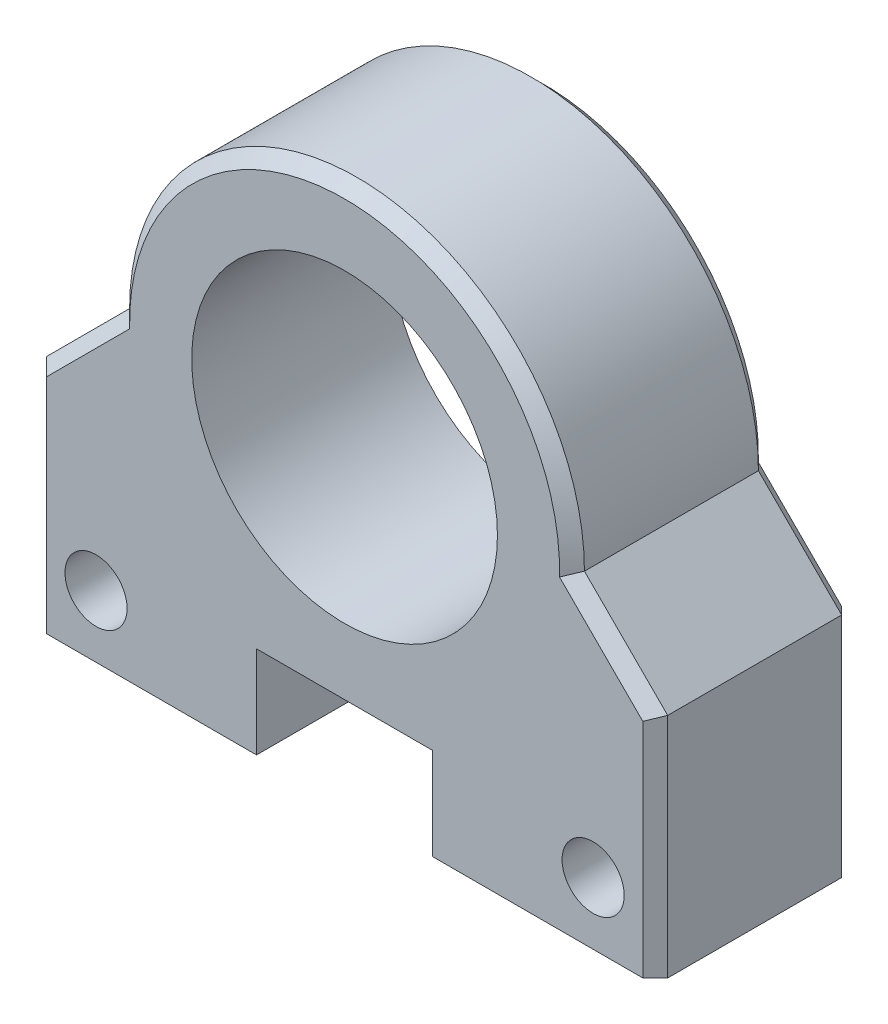
ISO-10303-21;
HEADER;
FILE_DESCRIPTION(('STEP AP214'),'2;1');
FILE_NAME('part.step','',(''),(''),'','','');
FILE_SCHEMA(('AUTOMOTIVE_DESIGN { 1 0 10303 214 1 1 1 1 }'));
ENDSEC;
DATA;
#1=APPLICATION_CONTEXT('core data for automotive mechanical design processes');
#2=APPLICATION_PROTOCOL_DEFINITION('international standard','automotive_design',2000,#1);
#3=PRODUCT_CONTEXT('',#1,'mechanical');
#4=PRODUCT('Part','Part','',(#3));
#5=PRODUCT_RELATED_PRODUCT_CATEGORY('part','',(#4));
#6=PRODUCT_DEFINITION_FORMATION('','',#4);
#7=PRODUCT_DEFINITION_CONTEXT('part definition',#1,'design');
#8=PRODUCT_DEFINITION('design','',#6,#7);
#9=PRODUCT_DEFINITION_SHAPE('','',#8);
#10=(LENGTH_UNIT() NAMED_UNIT(*) SI_UNIT(.MILLI.,.METRE.));
#11=(NAMED_UNIT(*) PLANE_ANGLE_UNIT() SI_UNIT($,.RADIAN.));
#12=(NAMED_UNIT(*) SI_UNIT($,.STERADIAN.) SOLID_ANGLE_UNIT());
#13=UNCERTAINTY_MEASURE_WITH_UNIT(LENGTH_MEASURE(1.E-05),#10,'distance_accuracy_value','');
#14=(GEOMETRIC_REPRESENTATION_CONTEXT(3) GLOBAL_UNCERTAINTY_ASSIGNED_CONTEXT((#13)) GLOBAL_UNIT_ASSIGNED_CONTEXT((#10,
#11,#12)) REPRESENTATION_CONTEXT('',''));
#15=CARTESIAN_POINT('',(0.,0.,0.));
#16=DIRECTION('',(0.,0.,1.));
#17=DIRECTION('',(1.,0.,0.));
#18=AXIS2_PLACEMENT_3D('',#15,#16,#17);
#19=CARTESIAN_POINT('',(0.,15.875,10.16));
#20=DIRECTION('',(0.,0.,-1.));
#21=DIRECTION('',(-1.,0.,0.));
#22=AXIS2_PLACEMENT_3D('',#19,#20,#21);
#23=PLANE('',#22);
#24=CARTESIAN_POINT('',(12.7,3.175,10.16));
#25=DIRECTION('',(0.,0.,1.));
#26=DIRECTION('',(-1.,0.,0.));
#27=AXIS2_PLACEMENT_3D('',#24,#25,#26);
#28=CIRCLE('',#27,1.5875);
#29=CARTESIAN_POINT('',(11.1125,3.175,10.16));
#30=VERTEX_POINT('',#29);
#31=EDGE_CURVE('E405',#30,#30,#28,.T.);
#32=ORIENTED_EDGE('',*,*,#31,.F.);
#33=EDGE_LOOP('',(#32));
#34=FACE_BOUND('',#33,.T.);
#35=CARTESIAN_POINT('',(-12.7,3.175,10.16));
#36=DIRECTION('',(0.,0.,1.));
#37=DIRECTION('',(1.,0.,0.));
#38=AXIS2_PLACEMENT_3D('',#35,#36,#37);
#39=CIRCLE('',#38,1.5875);
#40=CARTESIAN_POINT('',(-11.1125,3.175,10.16));
#41=VERTEX_POINT('',#40);
#42=EDGE_CURVE('E398',#41,#41,#39,.T.);
#43=ORIENTED_EDGE('',*,*,#42,.F.);
#44=EDGE_LOOP('',(#43));
#45=FACE_BOUND('',#44,.T.);
#46=DIRECTION('',(1.,0.,0.));
#47=VECTOR('',#46,1.);
#48=CARTESIAN_POINT('',(4.5,0.,10.16));
#49=LINE('',#48,#47);
#50=CARTESIAN_POINT('',(4.5,0.,10.16));
#51=VERTEX_POINT('',#50);
#52=CARTESIAN_POINT('',(15.24,0.,10.16));
#53=VERTEX_POINT('',#52);
#54=EDGE_CURVE('E389',#51,#53,#49,.T.);
#55=ORIENTED_EDGE('',*,*,#54,.T.);
#56=DIRECTION('',(0.,1.,0.));
#57=VECTOR('',#56,1.);
#58=CARTESIAN_POINT('',(15.24,15.875,10.16));
#59=LINE('',#58,#57);
#60=CARTESIAN_POINT('',(15.24,11.3574743878931,10.16));
#61=VERTEX_POINT('',#60);
#62=EDGE_CURVE('E11',#53,#61,#59,.T.);
#63=ORIENTED_EDGE('',*,*,#62,.T.);
#64=DIRECTION('',(-0.707106781186549,0.707106781186546,0.));
#65=VECTOR('',#64,1.);
#66=CARTESIAN_POINT('',(5.36123719394652,21.2362371939465,10.16));
#67=LINE('',#66,#65);
#68=CARTESIAN_POINT('',(10.9824239792477,15.6150504086454,10.16));
#69=VERTEX_POINT('',#68);
#70=EDGE_CURVE('E41',#61,#69,#67,.T.);
#71=ORIENTED_EDGE('',*,*,#70,.T.);
#72=CARTESIAN_POINT('',(0.,15.875,10.16));
#73=DIRECTION('',(0.,0.,-1.));
#74=DIRECTION('',(-1.,0.,0.));
#75=AXIS2_PLACEMENT_3D('',#72,#73,#74);
#76=CIRCLE('',#75,10.9855);
#77=CARTESIAN_POINT('',(-10.9824239792477,15.6150504086454,10.16));
#78=VERTEX_POINT('',#77);
#79=EDGE_CURVE('E218',#69,#78,#76,.F.);
#80=ORIENTED_EDGE('',*,*,#79,.T.);
#81=DIRECTION('',(-0.707106781186549,-0.707106781186546,0.));
#82=VECTOR('',#81,1.);
#83=CARTESIAN_POINT('',(-5.36123719394652,21.2362371939465,10.16));
#84=LINE('',#83,#82);
#85=CARTESIAN_POINT('',(-15.24,11.3574743878931,10.16));
#86=VERTEX_POINT('',#85);
#87=EDGE_CURVE('E57',#78,#86,#84,.T.);
#88=ORIENTED_EDGE('',*,*,#87,.T.);
#89=DIRECTION('',(0.,-1.,0.));
#90=VECTOR('',#89,1.);
#91=CARTESIAN_POINT('',(-15.24,15.875,10.16));
#92=LINE('',#91,#90);
#93=CARTESIAN_POINT('',(-15.24,0.,10.16));
#94=VERTEX_POINT('',#93);
#95=EDGE_CURVE('E221',#86,#94,#92,.T.);
#96=ORIENTED_EDGE('',*,*,#95,.T.);
#97=DIRECTION('',(1.,0.,0.));
#98=VECTOR('',#97,1.);
#99=CARTESIAN_POINT('',(-4.5,0.,10.16));
#100=LINE('',#99,#98);
#101=CARTESIAN_POINT('',(-4.5,0.,10.16));
#102=VERTEX_POINT('',#101);
#103=EDGE_CURVE('E165',#94,#102,#100,.T.);
#104=ORIENTED_EDGE('',*,*,#103,.T.);
#105=DIRECTION('',(0.,1.,0.));
#106=VECTOR('',#105,1.);
#107=CARTESIAN_POINT('',(-4.5,4.699,10.16));
#108=LINE('',#107,#106);
#109=CARTESIAN_POINT('',(-4.5,4.699,10.16));
#110=VERTEX_POINT('',#109);
#111=EDGE_CURVE('E159',#102,#110,#108,.T.);
#112=ORIENTED_EDGE('',*,*,#111,.T.);
#113=DIRECTION('',(1.,0.,0.));
#114=VECTOR('',#113,1.);
#115=CARTESIAN_POINT('',(4.5,4.699,10.16));
#116=LINE('',#115,#114);
#117=CARTESIAN_POINT('',(4.5,4.699,10.16));
#118=VERTEX_POINT('',#117);
#119=EDGE_CURVE('E149',#110,#118,#116,.T.);
#120=ORIENTED_EDGE('',*,*,#119,.T.);
#121=DIRECTION('',(0.,-1.,0.));
#122=VECTOR('',#121,1.);
#123=CARTESIAN_POINT('',(4.5,4.699,10.16));
#124=LINE('',#123,#122);
#125=EDGE_CURVE('E158',#118,#51,#124,.T.);
#126=ORIENTED_EDGE('',*,*,#125,.T.);
#127=EDGE_LOOP('',(#55,#63,#71,#80,#88,#96,#104,#112,#120,#126));
#128=FACE_BOUND('',#127,.T.);
#129=CARTESIAN_POINT('',(0.,15.875,10.16));
#130=DIRECTION('',(0.,0.,1.));
#131=DIRECTION('',(1.,0.,0.));
#132=AXIS2_PLACEMENT_3D('',#129,#130,#131);
#133=CIRCLE('',#132,7.8105);
#134=CARTESIAN_POINT('',(7.8105,15.875,10.16));
#135=VERTEX_POINT('',#134);
#136=EDGE_CURVE('E387',#135,#135,#133,.T.);
#137=ORIENTED_EDGE('',*,*,#136,.F.);
#138=EDGE_LOOP('',(#137));
#139=FACE_BOUND('',#138,.T.);
#140=ADVANCED_FACE('F32',(#34,#45,#128,#139),#23,.F.);
#141=CARTESIAN_POINT('',(0.,15.875,0.));
#142=DIRECTION('',(0.,0.,-1.));
#143=DIRECTION('',(-1.,0.,0.));
#144=AXIS2_PLACEMENT_3D('',#141,#142,#143);
#145=PLANE('',#144);
#146=CARTESIAN_POINT('',(12.7,3.175,0.));
#147=DIRECTION('',(0.,0.,1.));
#148=DIRECTION('',(-1.,0.,0.));
#149=AXIS2_PLACEMENT_3D('',#146,#147,#148);
#150=CIRCLE('',#149,1.5875);
#151=CARTESIAN_POINT('',(11.1125,3.175,0.));
#152=VERTEX_POINT('',#151);
#153=EDGE_CURVE('E402',#152,#152,#150,.T.);
#154=ORIENTED_EDGE('',*,*,#153,.T.);
#155=EDGE_LOOP('',(#154));
#156=FACE_BOUND('',#155,.T.);
#157=CARTESIAN_POINT('',(-12.7,3.175,0.));
#158=DIRECTION('',(0.,0.,1.));
#159=DIRECTION('',(1.,0.,0.));
#160=AXIS2_PLACEMENT_3D('',#157,#158,#159);
#161=CIRCLE('',#160,1.5875);
#162=CARTESIAN_POINT('',(-11.1125,3.175,0.));
#163=VERTEX_POINT('',#162);
#164=EDGE_CURVE('E401',#163,#163,#161,.T.);
#165=ORIENTED_EDGE('',*,*,#164,.T.);
#166=EDGE_LOOP('',(#165));
#167=FACE_BOUND('',#166,.T.);
#168=DIRECTION('',(0.707106781186549,-0.707106781186546,0.));
#169=VECTOR('',#168,1.);
#170=CARTESIAN_POINT('',(15.4259871939465,11.1714871939466,0.));
#171=LINE('',#170,#169);
#172=CARTESIAN_POINT('',(10.9824239792477,15.6150504086454,0.));
#173=VERTEX_POINT('',#172);
#174=CARTESIAN_POINT('',(15.24,11.3574743878931,0.));
#175=VERTEX_POINT('',#174);
#176=EDGE_CURVE('E190',#173,#175,#171,.T.);
#177=ORIENTED_EDGE('',*,*,#176,.T.);
#178=DIRECTION('',(0.,-1.,0.));
#179=VECTOR('',#178,1.);
#180=CARTESIAN_POINT('',(15.24,0.,0.));
#181=LINE('',#180,#179);
#182=CARTESIAN_POINT('',(15.24,0.,0.));
#183=VERTEX_POINT('',#182);
#184=EDGE_CURVE('E192',#175,#183,#181,.T.);
#185=ORIENTED_EDGE('',*,*,#184,.T.);
#186=DIRECTION('',(1.,0.,0.));
#187=VECTOR('',#186,1.);
#188=CARTESIAN_POINT('',(4.5,0.,0.));
#189=LINE('',#188,#187);
#190=CARTESIAN_POINT('',(4.5,0.,0.));
#191=VERTEX_POINT('',#190);
#192=EDGE_CURVE('E359',#191,#183,#189,.T.);
#193=ORIENTED_EDGE('',*,*,#192,.F.);
#194=DIRECTION('',(0.,-1.,0.));
#195=VECTOR('',#194,1.);
#196=CARTESIAN_POINT('',(4.5,4.699,0.));
#197=LINE('',#196,#195);
#198=CARTESIAN_POINT('',(4.5,4.699,0.));
#199=VERTEX_POINT('',#198);
#200=EDGE_CURVE('E382',#199,#191,#197,.T.);
#201=ORIENTED_EDGE('',*,*,#200,.F.);
#202=DIRECTION('',(1.,0.,0.));
#203=VECTOR('',#202,1.);
#204=CARTESIAN_POINT('',(4.5,4.699,0.));
#205=LINE('',#204,#203);
#206=CARTESIAN_POINT('',(-4.5,4.699,0.));
#207=VERTEX_POINT('',#206);
#208=EDGE_CURVE('E384',#207,#199,#205,.T.);
#209=ORIENTED_EDGE('',*,*,#208,.F.);
#210=DIRECTION('',(0.,1.,0.));
#211=VECTOR('',#210,1.);
#212=CARTESIAN_POINT('',(-4.5,4.699,0.));
#213=LINE('',#212,#211);
#214=CARTESIAN_POINT('',(-4.5,0.,0.));
#215=VERTEX_POINT('',#214);
#216=EDGE_CURVE('E173',#215,#207,#213,.T.);
#217=ORIENTED_EDGE('',*,*,#216,.F.);
#218=DIRECTION('',(1.,0.,0.));
#219=VECTOR('',#218,1.);
#220=CARTESIAN_POINT('',(-4.5,0.,0.));
#221=LINE('',#220,#219);
#222=CARTESIAN_POINT('',(-15.24,0.,0.));
#223=VERTEX_POINT('',#222);
#224=EDGE_CURVE('E169',#223,#215,#221,.T.);
#225=ORIENTED_EDGE('',*,*,#224,.F.);
#226=DIRECTION('',(0.,1.,0.));
#227=VECTOR('',#226,1.);
#228=CARTESIAN_POINT('',(-15.24,11.6205,0.));
#229=LINE('',#228,#227);
#230=CARTESIAN_POINT('',(-15.24,11.3574743878931,0.));
#231=VERTEX_POINT('',#230);
#232=EDGE_CURVE('E188',#223,#231,#229,.T.);
#233=ORIENTED_EDGE('',*,*,#232,.T.);
#234=DIRECTION('',(0.707106781186549,0.707106781186546,0.));
#235=VECTOR('',#234,1.);
#236=CARTESIAN_POINT('',(-11.1714871939465,15.4259871939465,0.));
#237=LINE('',#236,#235);
#238=CARTESIAN_POINT('',(-10.9824239792477,15.6150504086454,0.));
#239=VERTEX_POINT('',#238);
#240=EDGE_CURVE('E186',#231,#239,#237,.T.);
#241=ORIENTED_EDGE('',*,*,#240,.T.);
#242=CARTESIAN_POINT('',(0.,15.875,0.));
#243=DIRECTION('',(0.,0.,-1.));
#244=DIRECTION('',(-1.,0.,0.));
#245=AXIS2_PLACEMENT_3D('',#242,#243,#244);
#246=CIRCLE('',#245,10.9855);
#247=EDGE_CURVE('E184',#239,#173,#246,.T.);
#248=ORIENTED_EDGE('',*,*,#247,.T.);
#249=EDGE_LOOP('',(#177,#185,#193,#201,#209,#217,#225,#233,#241,#248));
#250=FACE_BOUND('',#249,.T.);
#251=CARTESIAN_POINT('',(0.,15.875,0.));
#252=DIRECTION('',(0.,0.,1.));
#253=DIRECTION('',(1.,0.,0.));
#254=AXIS2_PLACEMENT_3D('',#251,#252,#253);
#255=CIRCLE('',#254,7.8105);
#256=CARTESIAN_POINT('',(7.8105,15.875,0.));
#257=VERTEX_POINT('',#256);
#258=EDGE_CURVE('E392',#257,#257,#255,.T.);
#259=ORIENTED_EDGE('',*,*,#258,.T.);
#260=EDGE_LOOP('',(#259));
#261=FACE_BOUND('',#260,.T.);
#262=ADVANCED_FACE('F294',(#156,#167,#250,#261),#145,.T.);
#263=CARTESIAN_POINT('',(-4.5,4.699,10.16));
#264=DIRECTION('',(-1.,0.,0.));
#265=DIRECTION('',(0.,0.,1.));
#266=AXIS2_PLACEMENT_3D('',#263,#264,#265);
#267=PLANE('',#266);
#268=ORIENTED_EDGE('',*,*,#216,.T.);
#269=DIRECTION('',(0.,0.,-1.));
#270=VECTOR('',#269,1.);
#271=CARTESIAN_POINT('',(-4.5,4.699,10.16));
#272=LINE('',#271,#270);
#273=EDGE_CURVE('E153',#110,#207,#272,.T.);
#274=ORIENTED_EDGE('',*,*,#273,.F.);
#275=ORIENTED_EDGE('',*,*,#111,.F.);
#276=DIRECTION('',(0.,0.,-1.));
#277=VECTOR('',#276,1.);
#278=CARTESIAN_POINT('',(-4.5,0.,10.16));
#279=LINE('',#278,#277);
#280=EDGE_CURVE('E378',#102,#215,#279,.T.);
#281=ORIENTED_EDGE('',*,*,#280,.T.);
#282=EDGE_LOOP('',(#268,#274,#275,#281));
#283=FACE_BOUND('',#282,.T.);
#284=ADVANCED_FACE('F171',(#283),#267,.F.);
#285=CARTESIAN_POINT('',(4.5,4.699,10.16));
#286=DIRECTION('',(0.,1.,0.));
#287=DIRECTION('',(0.,0.,1.));
#288=AXIS2_PLACEMENT_3D('',#285,#286,#287);
#289=PLANE('',#288);
#290=ORIENTED_EDGE('',*,*,#208,.T.);
#291=DIRECTION('',(0.,0.,-1.));
#292=VECTOR('',#291,1.);
#293=CARTESIAN_POINT('',(4.5,4.699,10.16));
#294=LINE('',#293,#292);
#295=EDGE_CURVE('E156',#118,#199,#294,.T.);
#296=ORIENTED_EDGE('',*,*,#295,.F.);
#297=ORIENTED_EDGE('',*,*,#119,.F.);
#298=ORIENTED_EDGE('',*,*,#273,.T.);
#299=EDGE_LOOP('',(#290,#296,#297,#298));
#300=FACE_BOUND('',#299,.T.);
#301=ADVANCED_FACE('F151',(#300),#289,.F.);
#302=CARTESIAN_POINT('',(4.5,4.699,10.16));
#303=DIRECTION('',(1.,0.,0.));
#304=DIRECTION('',(0.,0.,-1.));
#305=AXIS2_PLACEMENT_3D('',#302,#303,#304);
#306=PLANE('',#305);
#307=ORIENTED_EDGE('',*,*,#200,.T.);
#308=DIRECTION('',(0.,0.,-1.));
#309=VECTOR('',#308,1.);
#310=CARTESIAN_POINT('',(4.5,0.,10.16));
#311=LINE('',#310,#309);
#312=EDGE_CURVE('E178',#51,#191,#311,.T.);
#313=ORIENTED_EDGE('',*,*,#312,.F.);
#314=ORIENTED_EDGE('',*,*,#125,.F.);
#315=ORIENTED_EDGE('',*,*,#295,.T.);
#316=EDGE_LOOP('',(#307,#313,#314,#315));
#317=FACE_BOUND('',#316,.T.);
#318=ADVANCED_FACE('F334',(#317),#306,.F.);
#319=CARTESIAN_POINT('',(4.5,0.,10.16));
#320=DIRECTION('',(0.,1.,0.));
#321=DIRECTION('',(-1.,0.,0.));
#322=AXIS2_PLACEMENT_3D('',#319,#320,#321);
#323=PLANE('',#322);
#324=ORIENTED_EDGE('',*,*,#192,.T.);
#325=DIRECTION('',(0.707106781186551,0.,0.707106781186544));
#326=VECTOR('',#325,1.);
#327=CARTESIAN_POINT('',(15.875,0.,0.634999999999997));
#328=LINE('',#327,#326);
#329=CARTESIAN_POINT('',(15.875,0.,0.634999999999998));
#330=VERTEX_POINT('',#329);
#331=EDGE_CURVE('E196',#183,#330,#328,.T.);
#332=ORIENTED_EDGE('',*,*,#331,.T.);
#333=DIRECTION('',(0.,0.,-1.));
#334=VECTOR('',#333,1.);
#335=CARTESIAN_POINT('',(15.875,0.,10.16));
#336=LINE('',#335,#334);
#337=CARTESIAN_POINT('',(15.875,0.,9.525));
#338=VERTEX_POINT('',#337);
#339=EDGE_CURVE('E355',#338,#330,#336,.T.);
#340=ORIENTED_EDGE('',*,*,#339,.F.);
#341=DIRECTION('',(0.707106781186548,0.,-0.707106781186548));
#342=VECTOR('',#341,1.);
#343=CARTESIAN_POINT('',(15.24,0.,10.16));
#344=LINE('',#343,#342);
#345=EDGE_CURVE('E194',#338,#53,#344,.F.);
#346=ORIENTED_EDGE('',*,*,#345,.T.);
#347=ORIENTED_EDGE('',*,*,#54,.F.);
#348=ORIENTED_EDGE('',*,*,#312,.T.);
#349=EDGE_LOOP('',(#324,#332,#340,#346,#347,#348));
#350=FACE_BOUND('',#349,.T.);
#351=ADVANCED_FACE('F330',(#350),#323,.F.);
#352=CARTESIAN_POINT('',(15.875,0.,10.16));
#353=DIRECTION('',(-1.,0.,0.));
#354=DIRECTION('',(0.,0.,1.));
#355=AXIS2_PLACEMENT_3D('',#352,#353,#354);
#356=PLANE('',#355);
#357=ORIENTED_EDGE('',*,*,#339,.T.);
#358=DIRECTION('',(0.,1.,0.));
#359=VECTOR('',#358,1.);
#360=CARTESIAN_POINT('',(15.875,11.6205,0.634999999999997));
#361=LINE('',#360,#359);
#362=CARTESIAN_POINT('',(15.875,11.6205,0.634999999999997));
#363=VERTEX_POINT('',#362);
#364=EDGE_CURVE('E176',#330,#363,#361,.T.);
#365=ORIENTED_EDGE('',*,*,#364,.T.);
#366=DIRECTION('',(0.,0.,-1.));
#367=VECTOR('',#366,1.);
#368=CARTESIAN_POINT('',(15.875,11.6205,10.16));
#369=LINE('',#368,#367);
#370=CARTESIAN_POINT('',(15.875,11.6205,9.525));
#371=VERTEX_POINT('',#370);
#372=EDGE_CURVE('E362',#371,#363,#369,.T.);
#373=ORIENTED_EDGE('',*,*,#372,.F.);
#374=DIRECTION('',(0.,-1.,0.));
#375=VECTOR('',#374,1.);
#376=CARTESIAN_POINT('',(15.875,0.,9.525));
#377=LINE('',#376,#375);
#378=EDGE_CURVE('E174',#371,#338,#377,.T.);
#379=ORIENTED_EDGE('',*,*,#378,.T.);
#380=EDGE_LOOP('',(#357,#365,#373,#379));
#381=FACE_BOUND('',#380,.T.);
#382=ADVANCED_FACE('F326',(#381),#356,.F.);
#383=CARTESIAN_POINT('',(15.875,11.6205,10.16));
#384=DIRECTION('',(-0.707106781186546,-0.707106781186549,0.));
#385=DIRECTION('',(0.707106781186549,-0.707106781186546,0.));
#386=AXIS2_PLACEMENT_3D('',#383,#384,#385);
#387=PLANE('',#386);
#388=ORIENTED_EDGE('',*,*,#372,.T.);
#389=DIRECTION('',(-0.707106781186549,0.707106781186546,0.));
#390=VECTOR('',#389,1.);
#391=CARTESIAN_POINT('',(11.6205,15.875,0.634999999999997));
#392=LINE('',#391,#390);
#393=CARTESIAN_POINT('',(11.6205,15.875,0.634999999999997));
#394=VERTEX_POINT('',#393);
#395=EDGE_CURVE('E200',#363,#394,#392,.T.);
#396=ORIENTED_EDGE('',*,*,#395,.T.);
#397=DIRECTION('',(0.,0.,-1.));
#398=VECTOR('',#397,1.);
#399=CARTESIAN_POINT('',(11.6205,15.875,10.16));
#400=LINE('',#399,#398);
#401=CARTESIAN_POINT('',(11.6205,15.875,9.525));
#402=VERTEX_POINT('',#401);
#403=EDGE_CURVE('E364',#402,#394,#400,.T.);
#404=ORIENTED_EDGE('',*,*,#403,.F.);
#405=DIRECTION('',(0.707106781186549,-0.707106781186546,0.));
#406=VECTOR('',#405,1.);
#407=CARTESIAN_POINT('',(15.875,11.6205,9.525));
#408=LINE('',#407,#406);
#409=EDGE_CURVE('E198',#402,#371,#408,.T.);
#410=ORIENTED_EDGE('',*,*,#409,.T.);
#411=EDGE_LOOP('',(#388,#396,#404,#410));
#412=FACE_BOUND('',#411,.T.);
#413=ADVANCED_FACE('F322',(#412),#387,.F.);
#414=CARTESIAN_POINT('',(0.,15.875,10.16));
#415=DIRECTION('',(0.,0.,-1.));
#416=DIRECTION('',(-1.,0.,0.));
#417=AXIS2_PLACEMENT_3D('',#414,#415,#416);
#418=CYLINDRICAL_SURFACE('',#417,11.6205);
#419=ORIENTED_EDGE('',*,*,#403,.T.);
#420=CARTESIAN_POINT('',(0.,15.875,0.634999999999997));
#421=DIRECTION('',(0.,0.,-1.));
#422=DIRECTION('',(-1.,0.,0.));
#423=AXIS2_PLACEMENT_3D('',#420,#421,#422);
#424=CIRCLE('',#423,11.6205);
#425=CARTESIAN_POINT('',(-11.6205,15.875,0.634999999999997));
#426=VERTEX_POINT('',#425);
#427=EDGE_CURVE('E216',#394,#426,#424,.F.);
#428=ORIENTED_EDGE('',*,*,#427,.T.);
#429=DIRECTION('',(0.,0.,-1.));
#430=VECTOR('',#429,1.);
#431=CARTESIAN_POINT('',(-11.6205,15.875,10.16));
#432=LINE('',#431,#430);
#433=CARTESIAN_POINT('',(-11.6205,15.875,9.525));
#434=VERTEX_POINT('',#433);
#435=EDGE_CURVE('E369',#434,#426,#432,.T.);
#436=ORIENTED_EDGE('',*,*,#435,.F.);
#437=CARTESIAN_POINT('',(0.,15.875,9.525));
#438=DIRECTION('',(0.,0.,-1.));
#439=DIRECTION('',(-1.,0.,0.));
#440=AXIS2_PLACEMENT_3D('',#437,#438,#439);
#441=CIRCLE('',#440,11.6205);
#442=EDGE_CURVE('E214',#434,#402,#441,.T.);
#443=ORIENTED_EDGE('',*,*,#442,.T.);
#444=EDGE_LOOP('',(#419,#428,#436,#443));
#445=FACE_BOUND('',#444,.T.);
#446=ADVANCED_FACE('F318',(#445),#418,.T.);
#447=CARTESIAN_POINT('',(-15.875,11.6205,10.16));
#448=DIRECTION('',(0.707106781186546,-0.707106781186549,0.));
#449=DIRECTION('',(0.707106781186549,0.707106781186546,0.));
#450=AXIS2_PLACEMENT_3D('',#447,#448,#449);
#451=PLANE('',#450);
#452=ORIENTED_EDGE('',*,*,#435,.T.);
#453=DIRECTION('',(-0.707106781186549,-0.707106781186546,0.));
#454=VECTOR('',#453,1.);
#455=CARTESIAN_POINT('',(-15.875,11.6205,0.634999999999997));
#456=LINE('',#455,#454);
#457=CARTESIAN_POINT('',(-15.875,11.6205,0.634999999999997));
#458=VERTEX_POINT('',#457);
#459=EDGE_CURVE('E212',#426,#458,#456,.T.);
#460=ORIENTED_EDGE('',*,*,#459,.T.);
#461=DIRECTION('',(0.,0.,-1.));
#462=VECTOR('',#461,1.);
#463=CARTESIAN_POINT('',(-15.875,11.6205,10.16));
#464=LINE('',#463,#462);
#465=CARTESIAN_POINT('',(-15.875,11.6205,9.525));
#466=VERTEX_POINT('',#465);
#467=EDGE_CURVE('E372',#466,#458,#464,.T.);
#468=ORIENTED_EDGE('',*,*,#467,.F.);
#469=DIRECTION('',(0.707106781186549,0.707106781186546,0.));
#470=VECTOR('',#469,1.);
#471=CARTESIAN_POINT('',(-15.875,11.6205,9.525));
#472=LINE('',#471,#470);
#473=EDGE_CURVE('E210',#466,#434,#472,.T.);
#474=ORIENTED_EDGE('',*,*,#473,.T.);
#475=EDGE_LOOP('',(#452,#460,#468,#474));
#476=FACE_BOUND('',#475,.T.);
#477=ADVANCED_FACE('F314',(#476),#451,.F.);
#478=CARTESIAN_POINT('',(-15.875,0.,10.16));
#479=DIRECTION('',(1.,0.,0.));
#480=DIRECTION('',(0.,0.,-1.));
#481=AXIS2_PLACEMENT_3D('',#478,#479,#480);
#482=PLANE('',#481);
#483=ORIENTED_EDGE('',*,*,#467,.T.);
#484=DIRECTION('',(0.,-1.,0.));
#485=VECTOR('',#484,1.);
#486=CARTESIAN_POINT('',(-15.875,0.,0.634999999999997));
#487=LINE('',#486,#485);
#488=CARTESIAN_POINT('',(-15.875,0.,0.634999999999998));
#489=VERTEX_POINT('',#488);
#490=EDGE_CURVE('E204',#458,#489,#487,.T.);
#491=ORIENTED_EDGE('',*,*,#490,.T.);
#492=DIRECTION('',(0.,0.,-1.));
#493=VECTOR('',#492,1.);
#494=CARTESIAN_POINT('',(-15.875,0.,10.16));
#495=LINE('',#494,#493);
#496=CARTESIAN_POINT('',(-15.875,0.,9.525));
#497=VERTEX_POINT('',#496);
#498=EDGE_CURVE('E375',#497,#489,#495,.T.);
#499=ORIENTED_EDGE('',*,*,#498,.F.);
#500=DIRECTION('',(0.,1.,0.));
#501=VECTOR('',#500,1.);
#502=CARTESIAN_POINT('',(-15.875,0.,9.525));
#503=LINE('',#502,#501);
#504=EDGE_CURVE('E202',#497,#466,#503,.T.);
#505=ORIENTED_EDGE('',*,*,#504,.T.);
#506=EDGE_LOOP('',(#483,#491,#499,#505));
#507=FACE_BOUND('',#506,.T.);
#508=ADVANCED_FACE('F310',(#507),#482,.F.);
#509=CARTESIAN_POINT('',(-4.5,0.,10.16));
#510=DIRECTION('',(0.,1.,0.));
#511=DIRECTION('',(-1.,0.,0.));
#512=AXIS2_PLACEMENT_3D('',#509,#510,#511);
#513=PLANE('',#512);
#514=ORIENTED_EDGE('',*,*,#498,.T.);
#515=DIRECTION('',(0.707106781186551,0.,-0.707106781186544));
#516=VECTOR('',#515,1.);
#517=CARTESIAN_POINT('',(-15.875,0.,0.634999999999997));
#518=LINE('',#517,#516);
#519=EDGE_CURVE('E208',#489,#223,#518,.T.);
#520=ORIENTED_EDGE('',*,*,#519,.T.);
#521=ORIENTED_EDGE('',*,*,#224,.T.);
#522=ORIENTED_EDGE('',*,*,#280,.F.);
#523=ORIENTED_EDGE('',*,*,#103,.F.);
#524=DIRECTION('',(0.707106781186548,0.,0.707106781186548));
#525=VECTOR('',#524,1.);
#526=CARTESIAN_POINT('',(-15.24,0.,10.16));
#527=LINE('',#526,#525);
#528=EDGE_CURVE('E206',#94,#497,#527,.F.);
#529=ORIENTED_EDGE('',*,*,#528,.T.);
#530=EDGE_LOOP('',(#514,#520,#521,#522,#523,#529));
#531=FACE_BOUND('',#530,.T.);
#532=ADVANCED_FACE('F307',(#531),#513,.F.);
#533=CARTESIAN_POINT('',(0.,15.875,10.16));
#534=DIRECTION('',(0.,0.,-1.));
#535=DIRECTION('',(-1.,0.,0.));
#536=AXIS2_PLACEMENT_3D('',#533,#534,#535);
#537=CYLINDRICAL_SURFACE('',#536,7.8105);
#538=ORIENTED_EDGE('',*,*,#136,.T.);
#539=EDGE_LOOP('',(#538));
#540=FACE_BOUND('',#539,.T.);
#541=ORIENTED_EDGE('',*,*,#258,.F.);
#542=EDGE_LOOP('',(#541));
#543=FACE_BOUND('',#542,.T.);
#544=ADVANCED_FACE('F256',(#540,#543),#537,.F.);
#545=CARTESIAN_POINT('',(-15.875,0.,0.634999999999997));
#546=DIRECTION('',(-0.707106781186544,0.,-0.707106781186551));
#547=DIRECTION('',(0.,1.,0.));
#548=AXIS2_PLACEMENT_3D('',#545,#546,#547);
#549=PLANE('',#548);
#550=ORIENTED_EDGE('',*,*,#519,.F.);
#551=ORIENTED_EDGE('',*,*,#490,.F.);
#552=DIRECTION('',(-0.67859834454585,0.281084637714823,0.678598344545843));
#553=VECTOR('',#552,1.);
#554=CARTESIAN_POINT('',(-15.875,11.6205,0.634999999999997));
#555=LINE('',#554,#553);
#556=EDGE_CURVE('E395',#231,#458,#555,.T.);
#557=ORIENTED_EDGE('',*,*,#556,.F.);
#558=ORIENTED_EDGE('',*,*,#232,.F.);
#559=EDGE_LOOP('',(#550,#551,#557,#558));
#560=FACE_BOUND('',#559,.T.);
#561=ADVANCED_FACE('F252',(#560),#549,.T.);
#562=CARTESIAN_POINT('',(-15.875,11.6205,0.634999999999997));
#563=DIRECTION('',(-0.499999999999996,0.499999999999998,-0.707106781186551));
#564=DIRECTION('',(0.707106781186549,0.707106781186546,0.));
#565=AXIS2_PLACEMENT_3D('',#562,#563,#564);
#566=PLANE('',#565);
#567=ORIENTED_EDGE('',*,*,#556,.T.);
#568=ORIENTED_EDGE('',*,*,#459,.F.);
#569=CARTESIAN_POINT('',(-10.9824239792477,15.6150504086454,0.));
#570=CARTESIAN_POINT('',(-11.0891479043448,15.6577958833368,0.105690826170341));
#571=CARTESIAN_POINT('',(-11.1956828762355,15.7008310897828,0.211452913535529));
#572=CARTESIAN_POINT('',(-11.4083748830444,15.7874809537342,0.423119580243149));
#573=CARTESIAN_POINT('',(-11.5145319180711,15.831095611073,0.529024159544625));
#574=CARTESIAN_POINT('',(-11.6205,15.875,0.634999999999994));
#575=B_SPLINE_CURVE_WITH_KNOTS('',3,(#569,#570,#571,#572,#573,#574),.UNSPECIFIED.,.F.,.F.,(4,2,
4),(0.,0.468493474000487,0.936986813373899),.UNSPECIFIED.);
#576=EDGE_CURVE('E234',#239,#426,#575,.T.);
#577=ORIENTED_EDGE('',*,*,#576,.F.);
#578=ORIENTED_EDGE('',*,*,#240,.F.);
#579=EDGE_LOOP('',(#567,#568,#577,#578));
#580=FACE_BOUND('',#579,.T.);
#581=ADVANCED_FACE('F246',(#580),#566,.T.);
#582=CARTESIAN_POINT('',(0.,15.875,0.634999999999997));
#583=DIRECTION('',(0.,0.,1.));
#584=DIRECTION('',(1.,0.,0.));
#585=AXIS2_PLACEMENT_3D('',#582,#583,#584);
#586=CONICAL_SURFACE('',#585,11.6205,0.785398163397454);
#587=ORIENTED_EDGE('',*,*,#576,.T.);
#588=ORIENTED_EDGE('',*,*,#427,.F.);
#589=CARTESIAN_POINT('',(11.6205,15.875,0.634999999999997));
#590=CARTESIAN_POINT('',(11.5145319180711,15.831095611073,0.529024159544627));
#591=CARTESIAN_POINT('',(11.4083748830444,15.7874809537342,0.423119580243149));
#592=CARTESIAN_POINT('',(11.1956828762355,15.7008310897828,0.211452913535528));
#593=CARTESIAN_POINT('',(11.0891479043448,15.6577958833368,0.10569082617034));
#594=CARTESIAN_POINT('',(10.9824239792477,15.6150504086454,0.));
#595=B_SPLINE_CURVE_WITH_KNOTS('',3,(#589,#590,#591,#592,#593,#594),.UNSPECIFIED.,.F.,.F.,(4,2,
4),(0.,0.46849333937341,0.936986813373897),.UNSPECIFIED.);
#596=EDGE_CURVE('E226',#173,#394,#595,.F.);
#597=ORIENTED_EDGE('',*,*,#596,.F.);
#598=ORIENTED_EDGE('',*,*,#247,.F.);
#599=EDGE_LOOP('',(#587,#588,#597,#598));
#600=FACE_BOUND('',#599,.T.);
#601=ADVANCED_FACE('F243',(#600),#586,.T.);
#602=CARTESIAN_POINT('',(15.875,11.6205,0.634999999999997));
#603=DIRECTION('',(0.499999999999996,0.499999999999998,-0.707106781186551));
#604=DIRECTION('',(0.707106781186549,-0.707106781186546,0.));
#605=AXIS2_PLACEMENT_3D('',#602,#603,#604);
#606=PLANE('',#605);
#607=ORIENTED_EDGE('',*,*,#596,.T.);
#608=ORIENTED_EDGE('',*,*,#395,.F.);
#609=DIRECTION('',(-0.67859834454585,-0.281084637714823,-0.678598344545843));
#610=VECTOR('',#609,1.);
#611=CARTESIAN_POINT('',(15.875,11.6205,0.634999999999997));
#612=LINE('',#611,#610);
#613=EDGE_CURVE('E224',#175,#363,#612,.F.);
#614=ORIENTED_EDGE('',*,*,#613,.F.);
#615=ORIENTED_EDGE('',*,*,#176,.F.);
#616=EDGE_LOOP('',(#607,#608,#614,#615));
#617=FACE_BOUND('',#616,.T.);
#618=ADVANCED_FACE('F240',(#617),#606,.T.);
#619=CARTESIAN_POINT('',(15.875,0.,0.634999999999997));
#620=DIRECTION('',(0.707106781186544,0.,-0.707106781186551));
#621=DIRECTION('',(0.,-1.,0.));
#622=AXIS2_PLACEMENT_3D('',#619,#620,#621);
#623=PLANE('',#622);
#624=ORIENTED_EDGE('',*,*,#331,.F.);
#625=ORIENTED_EDGE('',*,*,#184,.F.);
#626=ORIENTED_EDGE('',*,*,#613,.T.);
#627=ORIENTED_EDGE('',*,*,#364,.F.);
#628=EDGE_LOOP('',(#624,#625,#626,#627));
#629=FACE_BOUND('',#628,.T.);
#630=ADVANCED_FACE('F290',(#629),#623,.T.);
#631=CARTESIAN_POINT('',(-15.24,15.875,10.16));
#632=DIRECTION('',(0.707106781186548,0.,-0.707106781186548));
#633=DIRECTION('',(0.,-1.,0.));
#634=AXIS2_PLACEMENT_3D('',#631,#632,#633);
#635=PLANE('',#634);
#636=ORIENTED_EDGE('',*,*,#528,.F.);
#637=ORIENTED_EDGE('',*,*,#95,.F.);
#638=DIRECTION('',(0.678598344545847,-0.281084637714821,0.678598344545847));
#639=VECTOR('',#638,1.);
#640=CARTESIAN_POINT('',(-12.5751825590275,10.2536708625939,12.8248174409725));
#641=LINE('',#640,#639);
#642=EDGE_CURVE('E36',#466,#86,#641,.T.);
#643=ORIENTED_EDGE('',*,*,#642,.F.);
#644=ORIENTED_EDGE('',*,*,#504,.F.);
#645=EDGE_LOOP('',(#636,#637,#643,#644));
#646=FACE_BOUND('',#645,.T.);
#647=ADVANCED_FACE('F34',(#646),#635,.F.);
#648=CARTESIAN_POINT('',(-5.36123719394652,21.2362371939465,10.16));
#649=DIRECTION('',(0.499999999999999,-0.500000000000001,-0.707106781186548));
#650=DIRECTION('',(-0.707106781186549,-0.707106781186546,0.));
#651=AXIS2_PLACEMENT_3D('',#648,#649,#650);
#652=PLANE('',#651);
#653=ORIENTED_EDGE('',*,*,#642,.T.);
#654=ORIENTED_EDGE('',*,*,#87,.F.);
#655=CARTESIAN_POINT('',(-11.6205,15.875,9.525));
#656=CARTESIAN_POINT('',(-11.5145319180711,15.831095611073,9.63097584045537));
#657=CARTESIAN_POINT('',(-11.4083748830444,15.7874809537342,9.73688041975685));
#658=CARTESIAN_POINT('',(-11.1956828762355,15.7008310897828,9.94854708646447));
#659=CARTESIAN_POINT('',(-11.0891479043448,15.6577958833368,10.0543091738297));
#660=CARTESIAN_POINT('',(-10.9824239792477,15.6150504086454,10.16));
#661=B_SPLINE_CURVE_WITH_KNOTS('',3,(#655,#656,#657,#658,#659,#660),.UNSPECIFIED.,.F.,.F.,(4,2,
4),(0.,0.468493339373412,0.936986813373896),.UNSPECIFIED.);
#662=EDGE_CURVE('E276',#434,#78,#661,.T.);
#663=ORIENTED_EDGE('',*,*,#662,.F.);
#664=ORIENTED_EDGE('',*,*,#473,.F.);
#665=EDGE_LOOP('',(#653,#654,#663,#664));
#666=FACE_BOUND('',#665,.T.);
#667=ADVANCED_FACE('F281',(#666),#652,.F.);
#668=CARTESIAN_POINT('',(0.,15.875,10.16));
#669=DIRECTION('',(0.,0.,-1.));
#670=DIRECTION('',(-1.,0.,0.));
#671=AXIS2_PLACEMENT_3D('',#668,#669,#670);
#672=CONICAL_SURFACE('',#671,10.9855,0.785398163397448);
#673=ORIENTED_EDGE('',*,*,#662,.T.);
#674=ORIENTED_EDGE('',*,*,#79,.F.);
#675=CARTESIAN_POINT('',(10.9824239792477,15.6150504086454,10.16));
#676=CARTESIAN_POINT('',(11.0891479043448,15.6577958833368,10.0543091738297));
#677=CARTESIAN_POINT('',(11.1956828762355,15.7008310897828,9.94854708646447));
#678=CARTESIAN_POINT('',(11.4083748830444,15.7874809537342,9.73688041975685));
#679=CARTESIAN_POINT('',(11.5145319180711,15.831095611073,9.63097584045537));
#680=CARTESIAN_POINT('',(11.6205,15.875,9.525));
#681=B_SPLINE_CURVE_WITH_KNOTS('',3,(#675,#676,#677,#678,#679,#680),.UNSPECIFIED.,.F.,.F.,(4,2,
4),(0.,0.468493474000484,0.936986813373898),.UNSPECIFIED.);
#682=EDGE_CURVE('E270',#402,#69,#681,.F.);
#683=ORIENTED_EDGE('',*,*,#682,.F.);
#684=ORIENTED_EDGE('',*,*,#442,.F.);
#685=EDGE_LOOP('',(#673,#674,#683,#684));
#686=FACE_BOUND('',#685,.T.);
#687=ADVANCED_FACE('F266',(#686),#672,.T.);
#688=CARTESIAN_POINT('',(5.36123719394652,21.2362371939465,10.16));
#689=DIRECTION('',(-0.499999999999999,-0.500000000000001,-0.707106781186548));
#690=DIRECTION('',(-0.707106781186549,0.707106781186546,0.));
#691=AXIS2_PLACEMENT_3D('',#688,#689,#690);
#692=PLANE('',#691);
#693=ORIENTED_EDGE('',*,*,#682,.T.);
#694=ORIENTED_EDGE('',*,*,#70,.F.);
#695=DIRECTION('',(0.678598344545847,0.281084637714821,-0.678598344545847));
#696=VECTOR('',#695,1.);
#697=CARTESIAN_POINT('',(12.5751825590275,10.2536708625939,12.8248174409725));
#698=LINE('',#697,#696);
#699=EDGE_CURVE('E49',#371,#61,#698,.F.);
#700=ORIENTED_EDGE('',*,*,#699,.F.);
#701=ORIENTED_EDGE('',*,*,#409,.F.);
#702=EDGE_LOOP('',(#693,#694,#700,#701));
#703=FACE_BOUND('',#702,.T.);
#704=ADVANCED_FACE('F262',(#703),#692,.F.);
#705=CARTESIAN_POINT('',(15.24,15.875,10.16));
#706=DIRECTION('',(-0.707106781186548,0.,-0.707106781186548));
#707=DIRECTION('',(0.,1.,0.));
#708=AXIS2_PLACEMENT_3D('',#705,#706,#707);
#709=PLANE('',#708);
#710=ORIENTED_EDGE('',*,*,#345,.F.);
#711=ORIENTED_EDGE('',*,*,#378,.F.);
#712=ORIENTED_EDGE('',*,*,#699,.T.);
#713=ORIENTED_EDGE('',*,*,#62,.F.);
#714=EDGE_LOOP('',(#710,#711,#712,#713));
#715=FACE_BOUND('',#714,.T.);
#716=ADVANCED_FACE('F258',(#715),#709,.F.);
#717=CARTESIAN_POINT('',(-12.7,3.175,0.));
#718=DIRECTION('',(0.,0.,1.));
#719=DIRECTION('',(1.,0.,0.));
#720=AXIS2_PLACEMENT_3D('',#717,#718,#719);
#721=CYLINDRICAL_SURFACE('',#720,1.5875);
#722=ORIENTED_EDGE('',*,*,#164,.F.);
#723=EDGE_LOOP('',(#722));
#724=FACE_BOUND('',#723,.T.);
#725=ORIENTED_EDGE('',*,*,#42,.T.);
#726=EDGE_LOOP('',(#725));
#727=FACE_BOUND('',#726,.T.);
#728=ADVANCED_FACE('F261',(#724,#727),#721,.F.);
#729=CARTESIAN_POINT('',(12.7,3.175,0.));
#730=DIRECTION('',(0.,0.,1.));
#731=DIRECTION('',(1.,0.,0.));
#732=AXIS2_PLACEMENT_3D('',#729,#730,#731);
#733=CYLINDRICAL_SURFACE('',#732,1.5875);
#734=ORIENTED_EDGE('',*,*,#153,.F.);
#735=EDGE_LOOP('',(#734));
#736=FACE_BOUND('',#735,.T.);
#737=ORIENTED_EDGE('',*,*,#31,.T.);
#738=EDGE_LOOP('',(#737));
#739=FACE_BOUND('',#738,.T.);
#740=ADVANCED_FACE('F412',(#736,#739),#733,.F.);
#741=CLOSED_SHELL('',(#140,#262,#284,#301,#318,#351,#382,#413,#446,#477,#508,#532,#544,#561,
#581,#601,#618,#630,#647,#667,#687,#704,#716,#728,#740));
#742=MANIFOLD_SOLID_BREP('B2',#741);
#743=ADVANCED_BREP_SHAPE_REPRESENTATION('',(#18,#742),#14);
#744=SHAPE_DEFINITION_REPRESENTATION(#9,#743);
ENDSEC;
END-ISO-10303-21;
